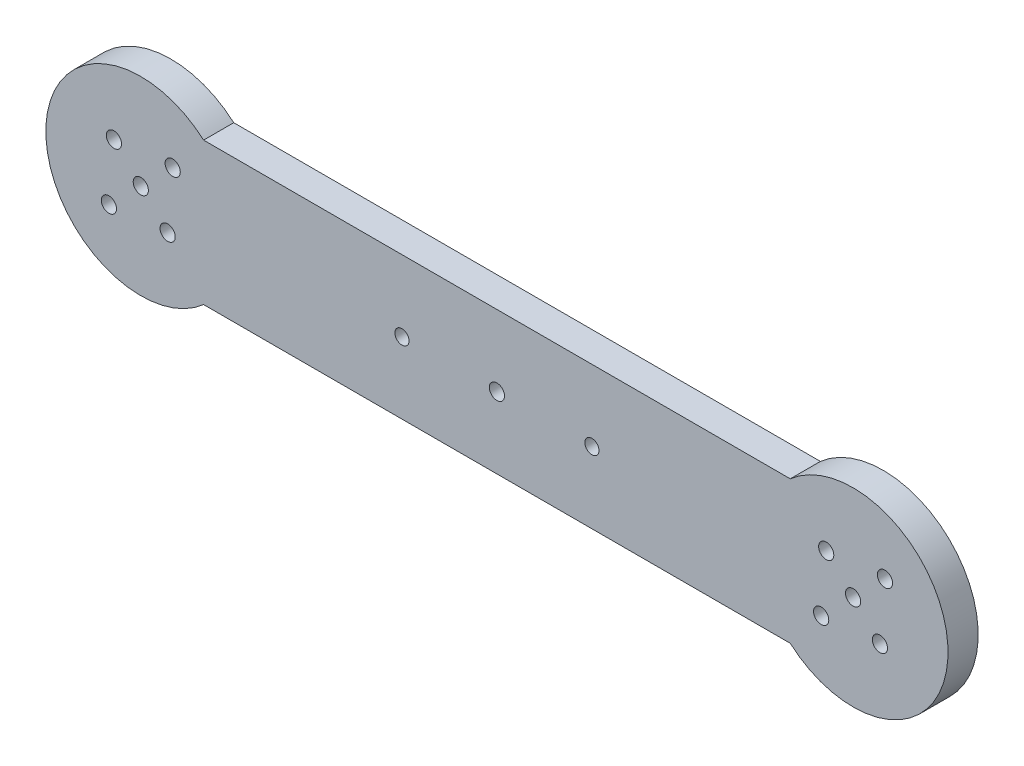
ISO-10303-21;
HEADER;
FILE_DESCRIPTION(('STEP AP214'),'2;1');
FILE_NAME('part.step','',(''),(''),'','','');
FILE_SCHEMA(('AUTOMOTIVE_DESIGN { 1 0 10303 214 1 1 1 1 }'));
ENDSEC;
DATA;
#1=APPLICATION_CONTEXT('core data for automotive mechanical design processes');
#2=APPLICATION_PROTOCOL_DEFINITION('international standard','automotive_design',2000,#1);
#3=PRODUCT_CONTEXT('',#1,'mechanical');
#4=PRODUCT('Part','Part','',(#3));
#5=PRODUCT_RELATED_PRODUCT_CATEGORY('part','',(#4));
#6=PRODUCT_DEFINITION_FORMATION('','',#4);
#7=PRODUCT_DEFINITION_CONTEXT('part definition',#1,'design');
#8=PRODUCT_DEFINITION('design','',#6,#7);
#9=PRODUCT_DEFINITION_SHAPE('','',#8);
#10=(LENGTH_UNIT() NAMED_UNIT(*) SI_UNIT(.MILLI.,.METRE.));
#11=(NAMED_UNIT(*) PLANE_ANGLE_UNIT() SI_UNIT($,.RADIAN.));
#12=(NAMED_UNIT(*) SI_UNIT($,.STERADIAN.) SOLID_ANGLE_UNIT());
#13=UNCERTAINTY_MEASURE_WITH_UNIT(LENGTH_MEASURE(1.E-05),#10,'distance_accuracy_value','');
#14=(GEOMETRIC_REPRESENTATION_CONTEXT(3) GLOBAL_UNCERTAINTY_ASSIGNED_CONTEXT((#13)) GLOBAL_UNIT_ASSIGNED_CONTEXT((#10,
#11,#12)) REPRESENTATION_CONTEXT('',''));
#15=CARTESIAN_POINT('',(0.,0.,0.));
#16=DIRECTION('',(0.,0.,1.));
#17=DIRECTION('',(1.,0.,0.));
#18=AXIS2_PLACEMENT_3D('',#15,#16,#17);
#19=CARTESIAN_POINT('',(-75.,0.,6.35));
#20=DIRECTION('',(0.,0.,1.));
#21=DIRECTION('',(1.,0.,0.));
#22=AXIS2_PLACEMENT_3D('',#19,#20,#21);
#23=PLANE('',#22);
#24=CARTESIAN_POINT('',(-75.,0.,6.35));
#25=DIRECTION('',(0.,0.,1.));
#26=DIRECTION('',(1.,0.,0.));
#27=AXIS2_PLACEMENT_3D('',#24,#25,#26);
#28=CIRCLE('',#27,1.6);
#29=CARTESIAN_POINT('',(-73.4,0.,6.35));
#30=VERTEX_POINT('',#29);
#31=EDGE_CURVE('E328',#30,#30,#28,.T.);
#32=ORIENTED_EDGE('',*,*,#31,.F.);
#33=EDGE_LOOP('',(#32));
#34=FACE_BOUND('',#33,.T.);
#35=CARTESIAN_POINT('',(-81.7175144212722,-6.71751442127216,6.35));
#36=DIRECTION('',(0.,0.,1.));
#37=DIRECTION('',(1.,0.,0.));
#38=AXIS2_PLACEMENT_3D('',#35,#36,#37);
#39=CIRCLE('',#38,1.6);
#40=CARTESIAN_POINT('',(-80.1175144212722,-6.71751442127216,6.35));
#41=VERTEX_POINT('',#40);
#42=EDGE_CURVE('E332',#41,#41,#39,.T.);
#43=ORIENTED_EDGE('',*,*,#42,.F.);
#44=EDGE_LOOP('',(#43));
#45=FACE_BOUND('',#44,.T.);
#46=CARTESIAN_POINT('',(-69.3431457505076,-5.65685424949239,6.35));
#47=DIRECTION('',(0.,0.,1.));
#48=DIRECTION('',(1.,0.,0.));
#49=AXIS2_PLACEMENT_3D('',#46,#47,#48);
#50=CIRCLE('',#49,1.6);
#51=CARTESIAN_POINT('',(-67.7431457505076,-5.65685424949239,6.35));
#52=VERTEX_POINT('',#51);
#53=EDGE_CURVE('E341',#52,#52,#50,.T.);
#54=ORIENTED_EDGE('',*,*,#53,.F.);
#55=EDGE_LOOP('',(#54));
#56=FACE_BOUND('',#55,.T.);
#57=CARTESIAN_POINT('',(-68.2824855787278,6.71751442127223,6.35));
#58=DIRECTION('',(0.,0.,1.));
#59=DIRECTION('',(1.,0.,0.));
#60=AXIS2_PLACEMENT_3D('',#57,#58,#59);
#61=CIRCLE('',#60,1.6);
#62=CARTESIAN_POINT('',(-66.6824855787278,6.71751442127223,6.35));
#63=VERTEX_POINT('',#62);
#64=EDGE_CURVE('E344',#63,#63,#61,.T.);
#65=ORIENTED_EDGE('',*,*,#64,.F.);
#66=EDGE_LOOP('',(#65));
#67=FACE_BOUND('',#66,.T.);
#68=CARTESIAN_POINT('',(-80.6568542494924,5.65685424949239,6.35));
#69=DIRECTION('',(0.,0.,1.));
#70=DIRECTION('',(1.,0.,0.));
#71=AXIS2_PLACEMENT_3D('',#68,#69,#70);
#72=CIRCLE('',#71,1.6);
#73=CARTESIAN_POINT('',(-79.0568542494924,5.65685424949239,6.35));
#74=VERTEX_POINT('',#73);
#75=EDGE_CURVE('E131',#74,#74,#72,.T.);
#76=ORIENTED_EDGE('',*,*,#75,.F.);
#77=EDGE_LOOP('',(#76));
#78=FACE_BOUND('',#77,.T.);
#79=CARTESIAN_POINT('',(0.,0.,6.35));
#80=DIRECTION('',(0.,0.,1.));
#81=DIRECTION('',(1.,0.,0.));
#82=AXIS2_PLACEMENT_3D('',#79,#80,#81);
#83=CIRCLE('',#82,1.6);
#84=CARTESIAN_POINT('',(1.6,0.,6.35));
#85=VERTEX_POINT('',#84);
#86=EDGE_CURVE('E119',#85,#85,#83,.T.);
#87=ORIENTED_EDGE('',*,*,#86,.F.);
#88=EDGE_LOOP('',(#87));
#89=FACE_BOUND('',#88,.T.);
#90=CARTESIAN_POINT('',(81.7175144212722,6.71751442127218,6.35));
#91=DIRECTION('',(0.,0.,1.));
#92=DIRECTION('',(1.,0.,0.));
#93=AXIS2_PLACEMENT_3D('',#90,#91,#92);
#94=CIRCLE('',#93,1.6);
#95=CARTESIAN_POINT('',(83.3175144212722,6.71751442127218,6.35));
#96=VERTEX_POINT('',#95);
#97=EDGE_CURVE('E118',#96,#96,#94,.T.);
#98=ORIENTED_EDGE('',*,*,#97,.F.);
#99=EDGE_LOOP('',(#98));
#100=FACE_BOUND('',#99,.T.);
#101=CARTESIAN_POINT('',(69.3431457505076,5.65685424949237,6.35));
#102=DIRECTION('',(0.,0.,1.));
#103=DIRECTION('',(1.,0.,0.));
#104=AXIS2_PLACEMENT_3D('',#101,#102,#103);
#105=CIRCLE('',#104,1.6);
#106=CARTESIAN_POINT('',(70.9431457505076,5.65685424949237,6.35));
#107=VERTEX_POINT('',#106);
#108=EDGE_CURVE('E137',#107,#107,#105,.T.);
#109=ORIENTED_EDGE('',*,*,#108,.F.);
#110=EDGE_LOOP('',(#109));
#111=FACE_BOUND('',#110,.T.);
#112=CARTESIAN_POINT('',(68.2824855787278,-6.71751442127222,6.35));
#113=DIRECTION('',(0.,0.,1.));
#114=DIRECTION('',(1.,0.,0.));
#115=AXIS2_PLACEMENT_3D('',#112,#113,#114);
#116=CIRCLE('',#115,1.6);
#117=CARTESIAN_POINT('',(69.8824855787278,-6.71751442127222,6.35));
#118=VERTEX_POINT('',#117);
#119=EDGE_CURVE('E143',#118,#118,#116,.T.);
#120=ORIENTED_EDGE('',*,*,#119,.F.);
#121=EDGE_LOOP('',(#120));
#122=FACE_BOUND('',#121,.T.);
#123=CARTESIAN_POINT('',(80.6568542494924,-5.6568542494924,6.35));
#124=DIRECTION('',(0.,0.,1.));
#125=DIRECTION('',(1.,0.,0.));
#126=AXIS2_PLACEMENT_3D('',#123,#124,#125);
#127=CIRCLE('',#126,1.6);
#128=CARTESIAN_POINT('',(82.2568542494924,-5.6568542494924,6.35));
#129=VERTEX_POINT('',#128);
#130=EDGE_CURVE('E115',#129,#129,#127,.T.);
#131=ORIENTED_EDGE('',*,*,#130,.F.);
#132=EDGE_LOOP('',(#131));
#133=FACE_BOUND('',#132,.T.);
#134=CARTESIAN_POINT('',(75.,0.,6.35));
#135=DIRECTION('',(0.,0.,1.));
#136=DIRECTION('',(1.,0.,0.));
#137=AXIS2_PLACEMENT_3D('',#134,#135,#136);
#138=CIRCLE('',#137,1.6);
#139=CARTESIAN_POINT('',(76.6,0.,6.35));
#140=VERTEX_POINT('',#139);
#141=EDGE_CURVE('E114',#140,#140,#138,.T.);
#142=ORIENTED_EDGE('',*,*,#141,.F.);
#143=EDGE_LOOP('',(#142));
#144=FACE_BOUND('',#143,.T.);
#145=CARTESIAN_POINT('',(-20.,0.,6.35));
#146=DIRECTION('',(0.,0.,1.));
#147=DIRECTION('',(1.,0.,0.));
#148=AXIS2_PLACEMENT_3D('',#145,#146,#147);
#149=CIRCLE('',#148,1.5);
#150=CARTESIAN_POINT('',(-18.5,0.,6.35));
#151=VERTEX_POINT('',#150);
#152=EDGE_CURVE('E106',#151,#151,#149,.T.);
#153=ORIENTED_EDGE('',*,*,#152,.F.);
#154=EDGE_LOOP('',(#153));
#155=FACE_BOUND('',#154,.T.);
#156=CARTESIAN_POINT('',(-75.,0.,6.35));
#157=DIRECTION('',(0.,0.,1.));
#158=DIRECTION('',(1.,0.,0.));
#159=AXIS2_PLACEMENT_3D('',#156,#157,#158);
#160=CIRCLE('',#159,20.);
#161=CARTESIAN_POINT('',(-61.771243444677,15.,6.35));
#162=VERTEX_POINT('',#161);
#163=CARTESIAN_POINT('',(-61.771243444677,-15.,6.35));
#164=VERTEX_POINT('',#163);
#165=EDGE_CURVE('E90',#162,#164,#160,.T.);
#166=ORIENTED_EDGE('',*,*,#165,.T.);
#167=DIRECTION('',(1.,0.,0.));
#168=VECTOR('',#167,1.);
#169=CARTESIAN_POINT('',(61.771243444677,-15.,6.35));
#170=LINE('',#169,#168);
#171=CARTESIAN_POINT('',(61.771243444677,-15.,6.35));
#172=VERTEX_POINT('',#171);
#173=EDGE_CURVE('E85',#164,#172,#170,.T.);
#174=ORIENTED_EDGE('',*,*,#173,.T.);
#175=CARTESIAN_POINT('',(75.,0.,6.35));
#176=DIRECTION('',(0.,0.,1.));
#177=DIRECTION('',(1.,0.,0.));
#178=AXIS2_PLACEMENT_3D('',#175,#176,#177);
#179=CIRCLE('',#178,20.);
#180=CARTESIAN_POINT('',(61.7712434446771,15.,6.35));
#181=VERTEX_POINT('',#180);
#182=EDGE_CURVE('E88',#172,#181,#179,.T.);
#183=ORIENTED_EDGE('',*,*,#182,.T.);
#184=DIRECTION('',(-1.,0.,0.));
#185=VECTOR('',#184,1.);
#186=CARTESIAN_POINT('',(61.7712434446771,15.,6.35));
#187=LINE('',#186,#185);
#188=EDGE_CURVE('E55',#181,#162,#187,.T.);
#189=ORIENTED_EDGE('',*,*,#188,.T.);
#190=EDGE_LOOP('',(#166,#174,#183,#189));
#191=FACE_BOUND('',#190,.T.);
#192=CARTESIAN_POINT('',(20.,0.,6.35));
#193=DIRECTION('',(0.,0.,1.));
#194=DIRECTION('',(1.,0.,0.));
#195=AXIS2_PLACEMENT_3D('',#192,#193,#194);
#196=CIRCLE('',#195,1.5);
#197=CARTESIAN_POINT('',(21.5,0.,6.35));
#198=VERTEX_POINT('',#197);
#199=EDGE_CURVE('E157',#198,#198,#196,.T.);
#200=ORIENTED_EDGE('',*,*,#199,.F.);
#201=EDGE_LOOP('',(#200));
#202=FACE_BOUND('',#201,.T.);
#203=ADVANCED_FACE('F36',(#34,#45,#56,#67,#78,#89,#100,#111,#122,#133,#144,#155,#191,#202),#23,.T.);
#204=CARTESIAN_POINT('',(-75.,0.,0.));
#205=DIRECTION('',(0.,0.,1.));
#206=DIRECTION('',(1.,0.,0.));
#207=AXIS2_PLACEMENT_3D('',#204,#205,#206);
#208=PLANE('',#207);
#209=CARTESIAN_POINT('',(-75.,0.,0.));
#210=DIRECTION('',(0.,0.,1.));
#211=DIRECTION('',(1.,0.,0.));
#212=AXIS2_PLACEMENT_3D('',#209,#210,#211);
#213=CIRCLE('',#212,1.6);
#214=CARTESIAN_POINT('',(-73.4,0.,0.));
#215=VERTEX_POINT('',#214);
#216=EDGE_CURVE('E331',#215,#215,#213,.T.);
#217=ORIENTED_EDGE('',*,*,#216,.T.);
#218=EDGE_LOOP('',(#217));
#219=FACE_BOUND('',#218,.T.);
#220=CARTESIAN_POINT('',(-81.7175144212722,-6.71751442127216,0.));
#221=DIRECTION('',(0.,0.,1.));
#222=DIRECTION('',(1.,0.,0.));
#223=AXIS2_PLACEMENT_3D('',#220,#221,#222);
#224=CIRCLE('',#223,1.6);
#225=CARTESIAN_POINT('',(-80.1175144212722,-6.71751442127216,0.));
#226=VERTEX_POINT('',#225);
#227=EDGE_CURVE('E335',#226,#226,#224,.T.);
#228=ORIENTED_EDGE('',*,*,#227,.T.);
#229=EDGE_LOOP('',(#228));
#230=FACE_BOUND('',#229,.T.);
#231=CARTESIAN_POINT('',(-69.3431457505076,-5.65685424949239,0.));
#232=DIRECTION('',(0.,0.,1.));
#233=DIRECTION('',(1.,0.,0.));
#234=AXIS2_PLACEMENT_3D('',#231,#232,#233);
#235=CIRCLE('',#234,1.6);
#236=CARTESIAN_POINT('',(-67.7431457505076,-5.65685424949239,0.));
#237=VERTEX_POINT('',#236);
#238=EDGE_CURVE('E40',#237,#237,#235,.T.);
#239=ORIENTED_EDGE('',*,*,#238,.T.);
#240=EDGE_LOOP('',(#239));
#241=FACE_BOUND('',#240,.T.);
#242=CARTESIAN_POINT('',(-68.2824855787278,6.71751442127223,0.));
#243=DIRECTION('',(0.,0.,1.));
#244=DIRECTION('',(1.,0.,0.));
#245=AXIS2_PLACEMENT_3D('',#242,#243,#244);
#246=CIRCLE('',#245,1.6);
#247=CARTESIAN_POINT('',(-66.6824855787278,6.71751442127223,0.));
#248=VERTEX_POINT('',#247);
#249=EDGE_CURVE('E347',#248,#248,#246,.T.);
#250=ORIENTED_EDGE('',*,*,#249,.T.);
#251=EDGE_LOOP('',(#250));
#252=FACE_BOUND('',#251,.T.);
#253=CARTESIAN_POINT('',(-80.6568542494924,5.65685424949239,0.));
#254=DIRECTION('',(0.,0.,1.));
#255=DIRECTION('',(1.,0.,0.));
#256=AXIS2_PLACEMENT_3D('',#253,#254,#255);
#257=CIRCLE('',#256,1.6);
#258=CARTESIAN_POINT('',(-79.0568542494924,5.65685424949239,0.));
#259=VERTEX_POINT('',#258);
#260=EDGE_CURVE('E126',#259,#259,#257,.T.);
#261=ORIENTED_EDGE('',*,*,#260,.T.);
#262=EDGE_LOOP('',(#261));
#263=FACE_BOUND('',#262,.T.);
#264=CARTESIAN_POINT('',(0.,0.,0.));
#265=DIRECTION('',(0.,0.,1.));
#266=DIRECTION('',(1.,0.,0.));
#267=AXIS2_PLACEMENT_3D('',#264,#265,#266);
#268=CIRCLE('',#267,1.6);
#269=CARTESIAN_POINT('',(1.6,0.,0.));
#270=VERTEX_POINT('',#269);
#271=EDGE_CURVE('E116',#270,#270,#268,.T.);
#272=ORIENTED_EDGE('',*,*,#271,.T.);
#273=EDGE_LOOP('',(#272));
#274=FACE_BOUND('',#273,.T.);
#275=CARTESIAN_POINT('',(81.7175144212722,6.71751442127218,0.));
#276=DIRECTION('',(0.,0.,1.));
#277=DIRECTION('',(1.,0.,0.));
#278=AXIS2_PLACEMENT_3D('',#275,#276,#277);
#279=CIRCLE('',#278,1.6);
#280=CARTESIAN_POINT('',(83.3175144212722,6.71751442127218,0.));
#281=VERTEX_POINT('',#280);
#282=EDGE_CURVE('E123',#281,#281,#279,.T.);
#283=ORIENTED_EDGE('',*,*,#282,.T.);
#284=EDGE_LOOP('',(#283));
#285=FACE_BOUND('',#284,.T.);
#286=CARTESIAN_POINT('',(69.3431457505076,5.65685424949237,0.));
#287=DIRECTION('',(0.,0.,1.));
#288=DIRECTION('',(1.,0.,0.));
#289=AXIS2_PLACEMENT_3D('',#286,#287,#288);
#290=CIRCLE('',#289,1.6);
#291=CARTESIAN_POINT('',(70.9431457505076,5.65685424949237,0.));
#292=VERTEX_POINT('',#291);
#293=EDGE_CURVE('E140',#292,#292,#290,.T.);
#294=ORIENTED_EDGE('',*,*,#293,.T.);
#295=EDGE_LOOP('',(#294));
#296=FACE_BOUND('',#295,.T.);
#297=CARTESIAN_POINT('',(68.2824855787278,-6.71751442127222,0.));
#298=DIRECTION('',(0.,0.,1.));
#299=DIRECTION('',(1.,0.,0.));
#300=AXIS2_PLACEMENT_3D('',#297,#298,#299);
#301=CIRCLE('',#300,1.6);
#302=CARTESIAN_POINT('',(69.8824855787278,-6.71751442127222,0.));
#303=VERTEX_POINT('',#302);
#304=EDGE_CURVE('E146',#303,#303,#301,.T.);
#305=ORIENTED_EDGE('',*,*,#304,.T.);
#306=EDGE_LOOP('',(#305));
#307=FACE_BOUND('',#306,.T.);
#308=CARTESIAN_POINT('',(80.6568542494924,-5.6568542494924,0.));
#309=DIRECTION('',(0.,0.,1.));
#310=DIRECTION('',(1.,0.,0.));
#311=AXIS2_PLACEMENT_3D('',#308,#309,#310);
#312=CIRCLE('',#311,1.6);
#313=CARTESIAN_POINT('',(82.2568542494924,-5.6568542494924,0.));
#314=VERTEX_POINT('',#313);
#315=EDGE_CURVE('E112',#314,#314,#312,.T.);
#316=ORIENTED_EDGE('',*,*,#315,.T.);
#317=EDGE_LOOP('',(#316));
#318=FACE_BOUND('',#317,.T.);
#319=CARTESIAN_POINT('',(75.,0.,0.));
#320=DIRECTION('',(0.,0.,1.));
#321=DIRECTION('',(1.,0.,0.));
#322=AXIS2_PLACEMENT_3D('',#319,#320,#321);
#323=CIRCLE('',#322,1.6);
#324=CARTESIAN_POINT('',(76.6,0.,0.));
#325=VERTEX_POINT('',#324);
#326=EDGE_CURVE('E153',#325,#325,#323,.T.);
#327=ORIENTED_EDGE('',*,*,#326,.T.);
#328=EDGE_LOOP('',(#327));
#329=FACE_BOUND('',#328,.T.);
#330=CARTESIAN_POINT('',(-75.,0.,0.));
#331=DIRECTION('',(0.,0.,1.));
#332=DIRECTION('',(1.,0.,0.));
#333=AXIS2_PLACEMENT_3D('',#330,#331,#332);
#334=CIRCLE('',#333,20.);
#335=CARTESIAN_POINT('',(-61.771243444677,15.,0.));
#336=VERTEX_POINT('',#335);
#337=CARTESIAN_POINT('',(-61.771243444677,-15.,0.));
#338=VERTEX_POINT('',#337);
#339=EDGE_CURVE('E103',#336,#338,#334,.T.);
#340=ORIENTED_EDGE('',*,*,#339,.F.);
#341=DIRECTION('',(-1.,0.,0.));
#342=VECTOR('',#341,1.);
#343=CARTESIAN_POINT('',(61.7712434446771,15.,0.));
#344=LINE('',#343,#342);
#345=CARTESIAN_POINT('',(61.7712434446771,15.,0.));
#346=VERTEX_POINT('',#345);
#347=EDGE_CURVE('E78',#346,#336,#344,.T.);
#348=ORIENTED_EDGE('',*,*,#347,.F.);
#349=CARTESIAN_POINT('',(75.,0.,0.));
#350=DIRECTION('',(0.,0.,1.));
#351=DIRECTION('',(1.,0.,0.));
#352=AXIS2_PLACEMENT_3D('',#349,#350,#351);
#353=CIRCLE('',#352,20.);
#354=CARTESIAN_POINT('',(61.771243444677,-15.,0.));
#355=VERTEX_POINT('',#354);
#356=EDGE_CURVE('E72',#355,#346,#353,.T.);
#357=ORIENTED_EDGE('',*,*,#356,.F.);
#358=DIRECTION('',(1.,0.,0.));
#359=VECTOR('',#358,1.);
#360=CARTESIAN_POINT('',(61.771243444677,-15.,0.));
#361=LINE('',#360,#359);
#362=EDGE_CURVE('E94',#338,#355,#361,.T.);
#363=ORIENTED_EDGE('',*,*,#362,.F.);
#364=EDGE_LOOP('',(#340,#348,#357,#363));
#365=FACE_BOUND('',#364,.T.);
#366=CARTESIAN_POINT('',(-20.,0.,0.));
#367=DIRECTION('',(0.,0.,1.));
#368=DIRECTION('',(1.,0.,0.));
#369=AXIS2_PLACEMENT_3D('',#366,#367,#368);
#370=CIRCLE('',#369,1.5);
#371=CARTESIAN_POINT('',(-18.5,0.,0.));
#372=VERTEX_POINT('',#371);
#373=EDGE_CURVE('E160',#372,#372,#370,.T.);
#374=ORIENTED_EDGE('',*,*,#373,.T.);
#375=EDGE_LOOP('',(#374));
#376=FACE_BOUND('',#375,.T.);
#377=CARTESIAN_POINT('',(20.,0.,0.));
#378=DIRECTION('',(0.,0.,1.));
#379=DIRECTION('',(1.,0.,0.));
#380=AXIS2_PLACEMENT_3D('',#377,#378,#379);
#381=CIRCLE('',#380,1.5);
#382=CARTESIAN_POINT('',(21.5,0.,0.));
#383=VERTEX_POINT('',#382);
#384=EDGE_CURVE('E156',#383,#383,#381,.T.);
#385=ORIENTED_EDGE('',*,*,#384,.T.);
#386=EDGE_LOOP('',(#385));
#387=FACE_BOUND('',#386,.T.);
#388=ADVANCED_FACE('F168',(#219,#230,#241,#252,#263,#274,#285,#296,#307,#318,#329,#365,#376,
#387),#208,.F.);
#389=CARTESIAN_POINT('',(-75.,0.,6.35));
#390=DIRECTION('',(0.,0.,-1.));
#391=DIRECTION('',(-1.,0.,0.));
#392=AXIS2_PLACEMENT_3D('',#389,#390,#391);
#393=CYLINDRICAL_SURFACE('',#392,20.);
#394=ORIENTED_EDGE('',*,*,#339,.T.);
#395=DIRECTION('',(0.,0.,-1.));
#396=VECTOR('',#395,1.);
#397=CARTESIAN_POINT('',(-61.771243444677,-15.,6.35));
#398=LINE('',#397,#396);
#399=EDGE_CURVE('E11',#164,#338,#398,.T.);
#400=ORIENTED_EDGE('',*,*,#399,.F.);
#401=ORIENTED_EDGE('',*,*,#165,.F.);
#402=DIRECTION('',(0.,0.,-1.));
#403=VECTOR('',#402,1.);
#404=CARTESIAN_POINT('',(-61.771243444677,15.,6.35));
#405=LINE('',#404,#403);
#406=EDGE_CURVE('E99',#162,#336,#405,.T.);
#407=ORIENTED_EDGE('',*,*,#406,.T.);
#408=EDGE_LOOP('',(#394,#400,#401,#407));
#409=FACE_BOUND('',#408,.T.);
#410=ADVANCED_FACE('F38',(#409),#393,.T.);
#411=CARTESIAN_POINT('',(61.771243444677,-15.,6.35));
#412=DIRECTION('',(0.,1.,0.));
#413=DIRECTION('',(-1.,0.,0.));
#414=AXIS2_PLACEMENT_3D('',#411,#412,#413);
#415=PLANE('',#414);
#416=ORIENTED_EDGE('',*,*,#362,.T.);
#417=DIRECTION('',(0.,0.,-1.));
#418=VECTOR('',#417,1.);
#419=CARTESIAN_POINT('',(61.771243444677,-15.,6.35));
#420=LINE('',#419,#418);
#421=EDGE_CURVE('E46',#172,#355,#420,.T.);
#422=ORIENTED_EDGE('',*,*,#421,.F.);
#423=ORIENTED_EDGE('',*,*,#173,.F.);
#424=ORIENTED_EDGE('',*,*,#399,.T.);
#425=EDGE_LOOP('',(#416,#422,#423,#424));
#426=FACE_BOUND('',#425,.T.);
#427=ADVANCED_FACE('F93',(#426),#415,.F.);
#428=CARTESIAN_POINT('',(75.,0.,6.35));
#429=DIRECTION('',(0.,0.,-1.));
#430=DIRECTION('',(-1.,0.,0.));
#431=AXIS2_PLACEMENT_3D('',#428,#429,#430);
#432=CYLINDRICAL_SURFACE('',#431,20.);
#433=ORIENTED_EDGE('',*,*,#356,.T.);
#434=DIRECTION('',(0.,0.,-1.));
#435=VECTOR('',#434,1.);
#436=CARTESIAN_POINT('',(61.7712434446771,15.,6.35));
#437=LINE('',#436,#435);
#438=EDGE_CURVE('E95',#181,#346,#437,.T.);
#439=ORIENTED_EDGE('',*,*,#438,.F.);
#440=ORIENTED_EDGE('',*,*,#182,.F.);
#441=ORIENTED_EDGE('',*,*,#421,.T.);
#442=EDGE_LOOP('',(#433,#439,#440,#441));
#443=FACE_BOUND('',#442,.T.);
#444=ADVANCED_FACE('F97',(#443),#432,.T.);
#445=CARTESIAN_POINT('',(61.7712434446771,15.,6.35));
#446=DIRECTION('',(0.,-1.,0.));
#447=DIRECTION('',(1.,0.,0.));
#448=AXIS2_PLACEMENT_3D('',#445,#446,#447);
#449=PLANE('',#448);
#450=ORIENTED_EDGE('',*,*,#347,.T.);
#451=ORIENTED_EDGE('',*,*,#406,.F.);
#452=ORIENTED_EDGE('',*,*,#188,.F.);
#453=ORIENTED_EDGE('',*,*,#438,.T.);
#454=EDGE_LOOP('',(#450,#451,#452,#453));
#455=FACE_BOUND('',#454,.T.);
#456=ADVANCED_FACE('F174',(#455),#449,.F.);
#457=CARTESIAN_POINT('',(-20.,0.,6.35));
#458=DIRECTION('',(0.,0.,-1.));
#459=DIRECTION('',(-1.,0.,0.));
#460=AXIS2_PLACEMENT_3D('',#457,#458,#459);
#461=CYLINDRICAL_SURFACE('',#460,1.5);
#462=ORIENTED_EDGE('',*,*,#152,.T.);
#463=EDGE_LOOP('',(#462));
#464=FACE_BOUND('',#463,.T.);
#465=ORIENTED_EDGE('',*,*,#373,.F.);
#466=EDGE_LOOP('',(#465));
#467=FACE_BOUND('',#466,.T.);
#468=ADVANCED_FACE('F171',(#464,#467),#461,.F.);
#469=CARTESIAN_POINT('',(20.,0.,6.35));
#470=DIRECTION('',(0.,0.,-1.));
#471=DIRECTION('',(-1.,0.,0.));
#472=AXIS2_PLACEMENT_3D('',#469,#470,#471);
#473=CYLINDRICAL_SURFACE('',#472,1.5);
#474=ORIENTED_EDGE('',*,*,#199,.T.);
#475=EDGE_LOOP('',(#474));
#476=FACE_BOUND('',#475,.T.);
#477=ORIENTED_EDGE('',*,*,#384,.F.);
#478=EDGE_LOOP('',(#477));
#479=FACE_BOUND('',#478,.T.);
#480=ADVANCED_FACE('F173',(#476,#479),#473,.F.);
#481=CARTESIAN_POINT('',(75.,0.,6.35));
#482=DIRECTION('',(0.,0.,1.));
#483=DIRECTION('',(1.,0.,0.));
#484=AXIS2_PLACEMENT_3D('',#481,#482,#483);
#485=CYLINDRICAL_SURFACE('',#484,1.6);
#486=ORIENTED_EDGE('',*,*,#141,.T.);
#487=EDGE_LOOP('',(#486));
#488=FACE_BOUND('',#487,.T.);
#489=ORIENTED_EDGE('',*,*,#326,.F.);
#490=EDGE_LOOP('',(#489));
#491=FACE_BOUND('',#490,.T.);
#492=ADVANCED_FACE('F181',(#488,#491),#485,.F.);
#493=CARTESIAN_POINT('',(80.6568542494924,-5.6568542494924,6.35));
#494=DIRECTION('',(0.,0.,1.));
#495=DIRECTION('',(1.,0.,0.));
#496=AXIS2_PLACEMENT_3D('',#493,#494,#495);
#497=CYLINDRICAL_SURFACE('',#496,1.6);
#498=ORIENTED_EDGE('',*,*,#130,.T.);
#499=EDGE_LOOP('',(#498));
#500=FACE_BOUND('',#499,.T.);
#501=ORIENTED_EDGE('',*,*,#315,.F.);
#502=EDGE_LOOP('',(#501));
#503=FACE_BOUND('',#502,.T.);
#504=ADVANCED_FACE('F222',(#500,#503),#497,.F.);
#505=CARTESIAN_POINT('',(68.2824855787278,-6.71751442127222,6.35));
#506=DIRECTION('',(0.,0.,1.));
#507=DIRECTION('',(1.,0.,0.));
#508=AXIS2_PLACEMENT_3D('',#505,#506,#507);
#509=CYLINDRICAL_SURFACE('',#508,1.6);
#510=ORIENTED_EDGE('',*,*,#119,.T.);
#511=EDGE_LOOP('',(#510));
#512=FACE_BOUND('',#511,.T.);
#513=ORIENTED_EDGE('',*,*,#304,.F.);
#514=EDGE_LOOP('',(#513));
#515=FACE_BOUND('',#514,.T.);
#516=ADVANCED_FACE('F233',(#512,#515),#509,.F.);
#517=CARTESIAN_POINT('',(69.3431457505076,5.65685424949237,6.35));
#518=DIRECTION('',(0.,0.,1.));
#519=DIRECTION('',(1.,0.,0.));
#520=AXIS2_PLACEMENT_3D('',#517,#518,#519);
#521=CYLINDRICAL_SURFACE('',#520,1.6);
#522=ORIENTED_EDGE('',*,*,#108,.T.);
#523=EDGE_LOOP('',(#522));
#524=FACE_BOUND('',#523,.T.);
#525=ORIENTED_EDGE('',*,*,#293,.F.);
#526=EDGE_LOOP('',(#525));
#527=FACE_BOUND('',#526,.T.);
#528=ADVANCED_FACE('F243',(#524,#527),#521,.F.);
#529=CARTESIAN_POINT('',(81.7175144212722,6.71751442127218,6.35));
#530=DIRECTION('',(0.,0.,1.));
#531=DIRECTION('',(1.,0.,0.));
#532=AXIS2_PLACEMENT_3D('',#529,#530,#531);
#533=CYLINDRICAL_SURFACE('',#532,1.6);
#534=ORIENTED_EDGE('',*,*,#97,.T.);
#535=EDGE_LOOP('',(#534));
#536=FACE_BOUND('',#535,.T.);
#537=ORIENTED_EDGE('',*,*,#282,.F.);
#538=EDGE_LOOP('',(#537));
#539=FACE_BOUND('',#538,.T.);
#540=ADVANCED_FACE('F253',(#536,#539),#533,.F.);
#541=CARTESIAN_POINT('',(0.,0.,6.35));
#542=DIRECTION('',(0.,0.,1.));
#543=DIRECTION('',(1.,0.,0.));
#544=AXIS2_PLACEMENT_3D('',#541,#542,#543);
#545=CYLINDRICAL_SURFACE('',#544,1.6);
#546=ORIENTED_EDGE('',*,*,#86,.T.);
#547=EDGE_LOOP('',(#546));
#548=FACE_BOUND('',#547,.T.);
#549=ORIENTED_EDGE('',*,*,#271,.F.);
#550=EDGE_LOOP('',(#549));
#551=FACE_BOUND('',#550,.T.);
#552=ADVANCED_FACE('F263',(#548,#551),#545,.F.);
#553=CARTESIAN_POINT('',(-80.6568542494924,5.65685424949239,6.35));
#554=DIRECTION('',(0.,0.,1.));
#555=DIRECTION('',(1.,0.,0.));
#556=AXIS2_PLACEMENT_3D('',#553,#554,#555);
#557=CYLINDRICAL_SURFACE('',#556,1.6);
#558=ORIENTED_EDGE('',*,*,#75,.T.);
#559=EDGE_LOOP('',(#558));
#560=FACE_BOUND('',#559,.T.);
#561=ORIENTED_EDGE('',*,*,#260,.F.);
#562=EDGE_LOOP('',(#561));
#563=FACE_BOUND('',#562,.T.);
#564=ADVANCED_FACE('F273',(#560,#563),#557,.F.);
#565=CARTESIAN_POINT('',(-68.2824855787278,6.71751442127223,6.35));
#566=DIRECTION('',(0.,0.,1.));
#567=DIRECTION('',(1.,0.,0.));
#568=AXIS2_PLACEMENT_3D('',#565,#566,#567);
#569=CYLINDRICAL_SURFACE('',#568,1.6);
#570=ORIENTED_EDGE('',*,*,#64,.T.);
#571=EDGE_LOOP('',(#570));
#572=FACE_BOUND('',#571,.T.);
#573=ORIENTED_EDGE('',*,*,#249,.F.);
#574=EDGE_LOOP('',(#573));
#575=FACE_BOUND('',#574,.T.);
#576=ADVANCED_FACE('F282',(#572,#575),#569,.F.);
#577=CARTESIAN_POINT('',(-69.3431457505076,-5.65685424949239,6.35));
#578=DIRECTION('',(0.,0.,1.));
#579=DIRECTION('',(1.,0.,0.));
#580=AXIS2_PLACEMENT_3D('',#577,#578,#579);
#581=CYLINDRICAL_SURFACE('',#580,1.6);
#582=ORIENTED_EDGE('',*,*,#53,.T.);
#583=EDGE_LOOP('',(#582));
#584=FACE_BOUND('',#583,.T.);
#585=ORIENTED_EDGE('',*,*,#238,.F.);
#586=EDGE_LOOP('',(#585));
#587=FACE_BOUND('',#586,.T.);
#588=ADVANCED_FACE('F292',(#584,#587),#581,.F.);
#589=CARTESIAN_POINT('',(-81.7175144212722,-6.71751442127216,6.35));
#590=DIRECTION('',(0.,0.,1.));
#591=DIRECTION('',(1.,0.,0.));
#592=AXIS2_PLACEMENT_3D('',#589,#590,#591);
#593=CYLINDRICAL_SURFACE('',#592,1.6);
#594=ORIENTED_EDGE('',*,*,#42,.T.);
#595=EDGE_LOOP('',(#594));
#596=FACE_BOUND('',#595,.T.);
#597=ORIENTED_EDGE('',*,*,#227,.F.);
#598=EDGE_LOOP('',(#597));
#599=FACE_BOUND('',#598,.T.);
#600=ADVANCED_FACE('F302',(#596,#599),#593,.F.);
#601=CARTESIAN_POINT('',(-75.,0.,6.35));
#602=DIRECTION('',(0.,0.,1.));
#603=DIRECTION('',(1.,0.,0.));
#604=AXIS2_PLACEMENT_3D('',#601,#602,#603);
#605=CYLINDRICAL_SURFACE('',#604,1.6);
#606=ORIENTED_EDGE('',*,*,#31,.T.);
#607=EDGE_LOOP('',(#606));
#608=FACE_BOUND('',#607,.T.);
#609=ORIENTED_EDGE('',*,*,#216,.F.);
#610=EDGE_LOOP('',(#609));
#611=FACE_BOUND('',#610,.T.);
#612=ADVANCED_FACE('F312',(#608,#611),#605,.F.);
#613=CLOSED_SHELL('',(#203,#388,#410,#427,#444,#456,#468,#480,#492,#504,#516,#528,#540,#552,
#564,#576,#588,#600,#612));
#614=MANIFOLD_SOLID_BREP('B2',#613);
#615=ADVANCED_BREP_SHAPE_REPRESENTATION('',(#18,#614),#14);
#616=SHAPE_DEFINITION_REPRESENTATION(#9,#615);
ENDSEC;
END-ISO-10303-21;
